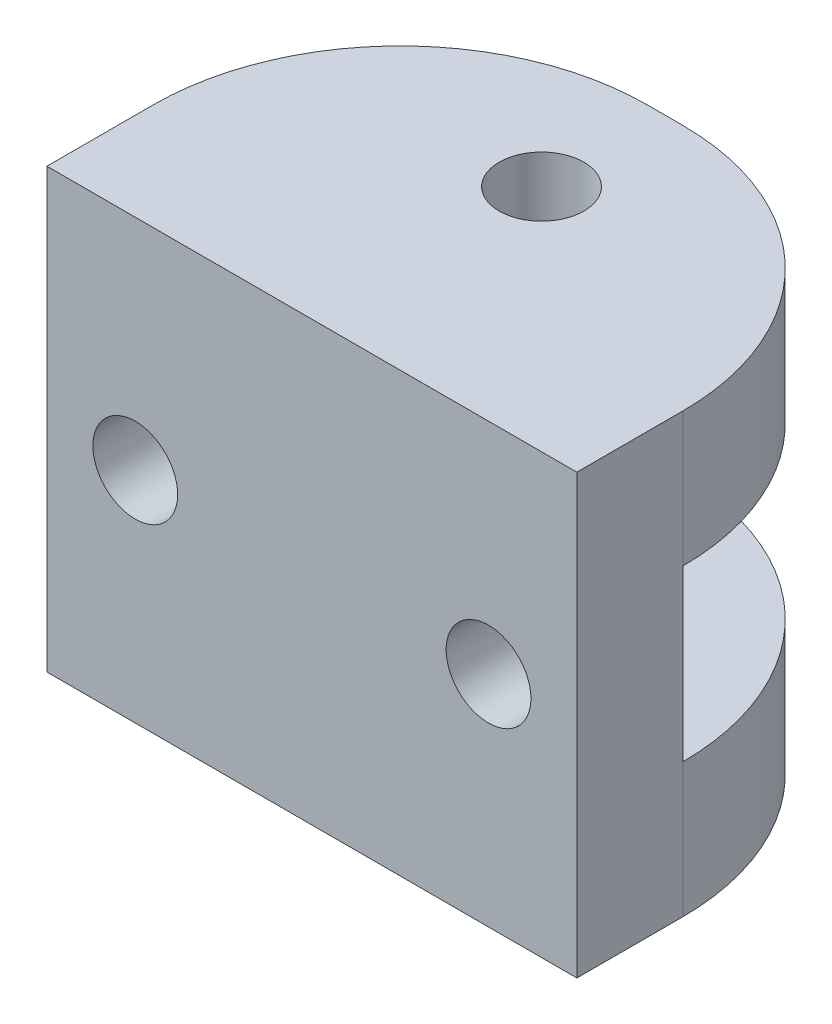
ISO-10303-21;
HEADER;
FILE_DESCRIPTION(('STEP AP214'),'2;1');
FILE_NAME('part.step','',(''),(''),'','','');
FILE_SCHEMA(('AUTOMOTIVE_DESIGN { 1 0 10303 214 1 1 1 1 }'));
ENDSEC;
DATA;
#1=APPLICATION_CONTEXT('core data for automotive mechanical design processes');
#2=APPLICATION_PROTOCOL_DEFINITION('international standard','automotive_design',2000,#1);
#3=PRODUCT_CONTEXT('',#1,'mechanical');
#4=PRODUCT('Part','Part','',(#3));
#5=PRODUCT_RELATED_PRODUCT_CATEGORY('part','',(#4));
#6=PRODUCT_DEFINITION_FORMATION('','',#4);
#7=PRODUCT_DEFINITION_CONTEXT('part definition',#1,'design');
#8=PRODUCT_DEFINITION('design','',#6,#7);
#9=PRODUCT_DEFINITION_SHAPE('','',#8);
#10=(LENGTH_UNIT() NAMED_UNIT(*) SI_UNIT(.MILLI.,.METRE.));
#11=(NAMED_UNIT(*) PLANE_ANGLE_UNIT() SI_UNIT($,.RADIAN.));
#12=(NAMED_UNIT(*) SI_UNIT($,.STERADIAN.) SOLID_ANGLE_UNIT());
#13=UNCERTAINTY_MEASURE_WITH_UNIT(LENGTH_MEASURE(1.E-05),#10,'distance_accuracy_value','');
#14=(GEOMETRIC_REPRESENTATION_CONTEXT(3) GLOBAL_UNCERTAINTY_ASSIGNED_CONTEXT((#13)) GLOBAL_UNIT_ASSIGNED_CONTEXT((#10,
#11,#12)) REPRESENTATION_CONTEXT('',''));
#15=CARTESIAN_POINT('',(0.,0.,0.));
#16=DIRECTION('',(0.,0.,1.));
#17=DIRECTION('',(1.,0.,0.));
#18=AXIS2_PLACEMENT_3D('',#15,#16,#17);
#19=CARTESIAN_POINT('',(75.,0.,0.));
#20=DIRECTION('',(0.,0.,-1.));
#21=DIRECTION('',(-1.,0.,0.));
#22=AXIS2_PLACEMENT_3D('',#19,#20,#21);
#23=PLANE('',#22);
#24=CARTESIAN_POINT('',(62.5,31.,0.));
#25=DIRECTION('',(0.,0.,1.));
#26=DIRECTION('',(1.,0.,0.));
#27=AXIS2_PLACEMENT_3D('',#24,#25,#26);
#28=CIRCLE('',#27,5.99999999999998);
#29=CARTESIAN_POINT('',(68.5,31.,0.));
#30=VERTEX_POINT('',#29);
#31=EDGE_CURVE('E152',#30,#30,#28,.T.);
#32=ORIENTED_EDGE('',*,*,#31,.F.);
#33=EDGE_LOOP('',(#32));
#34=FACE_BOUND('',#33,.T.);
#35=CARTESIAN_POINT('',(12.5,31.,0.));
#36=DIRECTION('',(0.,0.,1.));
#37=DIRECTION('',(1.,0.,0.));
#38=AXIS2_PLACEMENT_3D('',#35,#36,#37);
#39=CIRCLE('',#38,6.);
#40=CARTESIAN_POINT('',(18.5,31.,0.));
#41=VERTEX_POINT('',#40);
#42=EDGE_CURVE('E284',#41,#41,#39,.T.);
#43=ORIENTED_EDGE('',*,*,#42,.F.);
#44=EDGE_LOOP('',(#43));
#45=FACE_BOUND('',#44,.T.);
#46=DIRECTION('',(0.,-1.,0.));
#47=VECTOR('',#46,1.);
#48=CARTESIAN_POINT('',(0.,0.,0.));
#49=LINE('',#48,#47);
#50=CARTESIAN_POINT('',(0.,62.,0.));
#51=VERTEX_POINT('',#50);
#52=CARTESIAN_POINT('',(0.,0.,0.));
#53=VERTEX_POINT('',#52);
#54=EDGE_CURVE('E137',#51,#53,#49,.T.);
#55=ORIENTED_EDGE('',*,*,#54,.T.);
#56=DIRECTION('',(-1.,0.,0.));
#57=VECTOR('',#56,1.);
#58=CARTESIAN_POINT('',(75.,0.,0.));
#59=LINE('',#58,#57);
#60=CARTESIAN_POINT('',(75.,0.,0.));
#61=VERTEX_POINT('',#60);
#62=EDGE_CURVE('E116',#61,#53,#59,.T.);
#63=ORIENTED_EDGE('',*,*,#62,.F.);
#64=DIRECTION('',(0.,-1.,0.));
#65=VECTOR('',#64,1.);
#66=CARTESIAN_POINT('',(75.,0.,0.));
#67=LINE('',#66,#65);
#68=CARTESIAN_POINT('',(75.,62.,0.));
#69=VERTEX_POINT('',#68);
#70=EDGE_CURVE('E124',#69,#61,#67,.T.);
#71=ORIENTED_EDGE('',*,*,#70,.F.);
#72=DIRECTION('',(-1.,0.,0.));
#73=VECTOR('',#72,1.);
#74=CARTESIAN_POINT('',(75.,62.,0.));
#75=LINE('',#74,#73);
#76=EDGE_CURVE('E204',#69,#51,#75,.T.);
#77=ORIENTED_EDGE('',*,*,#76,.T.);
#78=EDGE_LOOP('',(#55,#63,#71,#77));
#79=FACE_BOUND('',#78,.T.);
#80=ADVANCED_FACE('F33',(#34,#45,#79),#23,.F.);
#81=CARTESIAN_POINT('',(75.,0.,0.));
#82=DIRECTION('',(0.,1.,0.));
#83=DIRECTION('',(0.,0.,1.));
#84=AXIS2_PLACEMENT_3D('',#81,#82,#83);
#85=PLANE('',#84);
#86=CARTESIAN_POINT('',(37.5,0.,-32.5));
#87=DIRECTION('',(0.,1.,0.));
#88=DIRECTION('',(0.,0.,1.));
#89=AXIS2_PLACEMENT_3D('',#86,#87,#88);
#90=CIRCLE('',#89,5.99999999999999);
#91=CARTESIAN_POINT('',(37.5,0.,-26.5));
#92=VERTEX_POINT('',#91);
#93=EDGE_CURVE('E409',#92,#92,#90,.T.);
#94=ORIENTED_EDGE('',*,*,#93,.T.);
#95=EDGE_LOOP('',(#94));
#96=FACE_BOUND('',#95,.T.);
#97=DIRECTION('',(-1.,0.,0.));
#98=VECTOR('',#97,1.);
#99=CARTESIAN_POINT('',(75.,0.,-50.));
#100=LINE('',#99,#98);
#101=CARTESIAN_POINT('',(40.,0.,-50.));
#102=VERTEX_POINT('',#101);
#103=CARTESIAN_POINT('',(35.,0.,-50.));
#104=VERTEX_POINT('',#103);
#105=EDGE_CURVE('E139',#102,#104,#100,.T.);
#106=ORIENTED_EDGE('',*,*,#105,.F.);
#107=CARTESIAN_POINT('',(40.,0.,-15.));
#108=DIRECTION('',(0.,1.,0.));
#109=DIRECTION('',(0.,0.,1.));
#110=AXIS2_PLACEMENT_3D('',#107,#108,#109);
#111=CIRCLE('',#110,35.);
#112=CARTESIAN_POINT('',(75.,0.,-15.));
#113=VERTEX_POINT('',#112);
#114=EDGE_CURVE('E119',#102,#113,#111,.F.);
#115=ORIENTED_EDGE('',*,*,#114,.T.);
#116=DIRECTION('',(0.,0.,-1.));
#117=VECTOR('',#116,1.);
#118=CARTESIAN_POINT('',(75.,0.,0.));
#119=LINE('',#118,#117);
#120=EDGE_CURVE('E110',#61,#113,#119,.T.);
#121=ORIENTED_EDGE('',*,*,#120,.F.);
#122=ORIENTED_EDGE('',*,*,#62,.T.);
#123=DIRECTION('',(0.,0.,-1.));
#124=VECTOR('',#123,1.);
#125=CARTESIAN_POINT('',(0.,0.,0.));
#126=LINE('',#125,#124);
#127=CARTESIAN_POINT('',(0.,0.,-15.));
#128=VERTEX_POINT('',#127);
#129=EDGE_CURVE('E294',#53,#128,#126,.T.);
#130=ORIENTED_EDGE('',*,*,#129,.T.);
#131=CARTESIAN_POINT('',(35.,0.,-15.));
#132=DIRECTION('',(0.,1.,0.));
#133=DIRECTION('',(0.,0.,1.));
#134=AXIS2_PLACEMENT_3D('',#131,#132,#133);
#135=CIRCLE('',#134,35.);
#136=EDGE_CURVE('E165',#128,#104,#135,.F.);
#137=ORIENTED_EDGE('',*,*,#136,.T.);
#138=EDGE_LOOP('',(#106,#115,#121,#122,#130,#137));
#139=FACE_BOUND('',#138,.T.);
#140=ADVANCED_FACE('F113',(#96,#139),#85,.F.);
#141=CARTESIAN_POINT('',(75.,19.,-50.));
#142=DIRECTION('',(0.,0.,1.));
#143=DIRECTION('',(1.,0.,0.));
#144=AXIS2_PLACEMENT_3D('',#141,#142,#143);
#145=PLANE('',#144);
#146=DIRECTION('',(-1.,0.,0.));
#147=VECTOR('',#146,1.);
#148=CARTESIAN_POINT('',(75.,19.,-50.));
#149=LINE('',#148,#147);
#150=CARTESIAN_POINT('',(40.,19.,-50.));
#151=VERTEX_POINT('',#150);
#152=CARTESIAN_POINT('',(35.,19.,-50.));
#153=VERTEX_POINT('',#152);
#154=EDGE_CURVE('E144',#151,#153,#149,.T.);
#155=ORIENTED_EDGE('',*,*,#154,.F.);
#156=DIRECTION('',(0.,1.,0.));
#157=VECTOR('',#156,1.);
#158=CARTESIAN_POINT('',(40.,19.,-50.));
#159=LINE('',#158,#157);
#160=EDGE_CURVE('E163',#151,#102,#159,.F.);
#161=ORIENTED_EDGE('',*,*,#160,.T.);
#162=ORIENTED_EDGE('',*,*,#105,.T.);
#163=DIRECTION('',(0.,1.,0.));
#164=VECTOR('',#163,1.);
#165=CARTESIAN_POINT('',(35.,19.,-50.));
#166=LINE('',#165,#164);
#167=EDGE_CURVE('E160',#104,#153,#166,.T.);
#168=ORIENTED_EDGE('',*,*,#167,.T.);
#169=EDGE_LOOP('',(#155,#161,#162,#168));
#170=FACE_BOUND('',#169,.T.);
#171=ADVANCED_FACE('F216',(#170),#145,.F.);
#172=CARTESIAN_POINT('',(75.,19.,-15.));
#173=DIRECTION('',(0.,-1.,0.));
#174=DIRECTION('',(0.,0.,-1.));
#175=AXIS2_PLACEMENT_3D('',#172,#173,#174);
#176=PLANE('',#175);
#177=CARTESIAN_POINT('',(37.5,19.,-32.5));
#178=DIRECTION('',(0.,-1.,0.));
#179=DIRECTION('',(0.,0.,-1.));
#180=AXIS2_PLACEMENT_3D('',#177,#178,#179);
#181=CIRCLE('',#180,5.99999999999999);
#182=CARTESIAN_POINT('',(37.5,19.,-38.5));
#183=VERTEX_POINT('',#182);
#184=EDGE_CURVE('E287',#183,#183,#181,.T.);
#185=ORIENTED_EDGE('',*,*,#184,.T.);
#186=EDGE_LOOP('',(#185));
#187=FACE_BOUND('',#186,.T.);
#188=DIRECTION('',(-1.,0.,0.));
#189=VECTOR('',#188,1.);
#190=CARTESIAN_POINT('',(75.,19.,-15.));
#191=LINE('',#190,#189);
#192=CARTESIAN_POINT('',(75.,19.,-15.));
#193=VERTEX_POINT('',#192);
#194=CARTESIAN_POINT('',(0.,19.,-15.));
#195=VERTEX_POINT('',#194);
#196=EDGE_CURVE('E196',#193,#195,#191,.T.);
#197=ORIENTED_EDGE('',*,*,#196,.F.);
#198=CARTESIAN_POINT('',(40.,19.,-15.));
#199=DIRECTION('',(0.,-1.,0.));
#200=DIRECTION('',(0.,0.,-1.));
#201=AXIS2_PLACEMENT_3D('',#198,#199,#200);
#202=CIRCLE('',#201,35.);
#203=EDGE_CURVE('E158',#193,#151,#202,.F.);
#204=ORIENTED_EDGE('',*,*,#203,.T.);
#205=ORIENTED_EDGE('',*,*,#154,.T.);
#206=CARTESIAN_POINT('',(35.,19.,-15.));
#207=DIRECTION('',(0.,-1.,0.));
#208=DIRECTION('',(0.,0.,-1.));
#209=AXIS2_PLACEMENT_3D('',#206,#207,#208);
#210=CIRCLE('',#209,35.);
#211=EDGE_CURVE('E156',#153,#195,#210,.F.);
#212=ORIENTED_EDGE('',*,*,#211,.T.);
#213=EDGE_LOOP('',(#197,#204,#205,#212));
#214=FACE_BOUND('',#213,.T.);
#215=ADVANCED_FACE('F213',(#187,#214),#176,.F.);
#216=CARTESIAN_POINT('',(75.,43.,-15.));
#217=DIRECTION('',(0.,0.,1.));
#218=DIRECTION('',(1.,0.,0.));
#219=AXIS2_PLACEMENT_3D('',#216,#217,#218);
#220=PLANE('',#219);
#221=CARTESIAN_POINT('',(62.5,31.,-15.));
#222=DIRECTION('',(0.,0.,1.));
#223=DIRECTION('',(1.,0.,0.));
#224=AXIS2_PLACEMENT_3D('',#221,#222,#223);
#225=CIRCLE('',#224,5.99999999999998);
#226=CARTESIAN_POINT('',(68.5,31.,-15.));
#227=VERTEX_POINT('',#226);
#228=EDGE_CURVE('E151',#227,#227,#225,.T.);
#229=ORIENTED_EDGE('',*,*,#228,.T.);
#230=EDGE_LOOP('',(#229));
#231=FACE_BOUND('',#230,.T.);
#232=CARTESIAN_POINT('',(12.5,31.,-15.));
#233=DIRECTION('',(0.,0.,1.));
#234=DIRECTION('',(1.,0.,0.));
#235=AXIS2_PLACEMENT_3D('',#232,#233,#234);
#236=CIRCLE('',#235,6.);
#237=CARTESIAN_POINT('',(18.5,31.,-15.));
#238=VERTEX_POINT('',#237);
#239=EDGE_CURVE('E148',#238,#238,#236,.T.);
#240=ORIENTED_EDGE('',*,*,#239,.T.);
#241=EDGE_LOOP('',(#240));
#242=FACE_BOUND('',#241,.T.);
#243=DIRECTION('',(0.,1.,0.));
#244=VECTOR('',#243,1.);
#245=CARTESIAN_POINT('',(0.,43.,-15.));
#246=LINE('',#245,#244);
#247=CARTESIAN_POINT('',(0.,43.,-15.));
#248=VERTEX_POINT('',#247);
#249=EDGE_CURVE('E195',#195,#248,#246,.T.);
#250=ORIENTED_EDGE('',*,*,#249,.T.);
#251=DIRECTION('',(-1.,0.,0.));
#252=VECTOR('',#251,1.);
#253=CARTESIAN_POINT('',(75.,43.,-15.));
#254=LINE('',#253,#252);
#255=CARTESIAN_POINT('',(75.,43.,-15.));
#256=VERTEX_POINT('',#255);
#257=EDGE_CURVE('E183',#256,#248,#254,.T.);
#258=ORIENTED_EDGE('',*,*,#257,.F.);
#259=DIRECTION('',(0.,1.,0.));
#260=VECTOR('',#259,1.);
#261=CARTESIAN_POINT('',(75.,43.,-15.));
#262=LINE('',#261,#260);
#263=EDGE_CURVE('E123',#193,#256,#262,.T.);
#264=ORIENTED_EDGE('',*,*,#263,.F.);
#265=ORIENTED_EDGE('',*,*,#196,.T.);
#266=EDGE_LOOP('',(#250,#258,#264,#265));
#267=FACE_BOUND('',#266,.T.);
#268=ADVANCED_FACE('F193',(#231,#242,#267),#220,.F.);
#269=CARTESIAN_POINT('',(75.,43.,-50.));
#270=DIRECTION('',(0.,1.,0.));
#271=DIRECTION('',(0.,0.,1.));
#272=AXIS2_PLACEMENT_3D('',#269,#270,#271);
#273=PLANE('',#272);
#274=CARTESIAN_POINT('',(37.5,43.,-32.5));
#275=DIRECTION('',(0.,1.,0.));
#276=DIRECTION('',(0.,0.,1.));
#277=AXIS2_PLACEMENT_3D('',#274,#275,#276);
#278=CIRCLE('',#277,5.99999999999999);
#279=CARTESIAN_POINT('',(37.5,43.,-26.5));
#280=VERTEX_POINT('',#279);
#281=EDGE_CURVE('E406',#280,#280,#278,.T.);
#282=ORIENTED_EDGE('',*,*,#281,.T.);
#283=EDGE_LOOP('',(#282));
#284=FACE_BOUND('',#283,.T.);
#285=ORIENTED_EDGE('',*,*,#257,.T.);
#286=CARTESIAN_POINT('',(35.,43.,-15.));
#287=DIRECTION('',(0.,1.,0.));
#288=DIRECTION('',(0.,0.,1.));
#289=AXIS2_PLACEMENT_3D('',#286,#287,#288);
#290=CIRCLE('',#289,35.);
#291=CARTESIAN_POINT('',(35.,43.,-50.));
#292=VERTEX_POINT('',#291);
#293=EDGE_CURVE('E11',#248,#292,#290,.F.);
#294=ORIENTED_EDGE('',*,*,#293,.T.);
#295=DIRECTION('',(-1.,0.,0.));
#296=VECTOR('',#295,1.);
#297=CARTESIAN_POINT('',(75.,43.,-50.));
#298=LINE('',#297,#296);
#299=CARTESIAN_POINT('',(40.,43.,-50.));
#300=VERTEX_POINT('',#299);
#301=EDGE_CURVE('E184',#300,#292,#298,.T.);
#302=ORIENTED_EDGE('',*,*,#301,.F.);
#303=CARTESIAN_POINT('',(40.,43.,-15.));
#304=DIRECTION('',(0.,1.,0.));
#305=DIRECTION('',(0.,0.,1.));
#306=AXIS2_PLACEMENT_3D('',#303,#304,#305);
#307=CIRCLE('',#306,35.);
#308=EDGE_CURVE('E41',#300,#256,#307,.F.);
#309=ORIENTED_EDGE('',*,*,#308,.T.);
#310=EDGE_LOOP('',(#285,#294,#302,#309));
#311=FACE_BOUND('',#310,.T.);
#312=ADVANCED_FACE('F181',(#284,#311),#273,.F.);
#313=CARTESIAN_POINT('',(75.,62.,-50.));
#314=DIRECTION('',(0.,0.,1.));
#315=DIRECTION('',(1.,0.,0.));
#316=AXIS2_PLACEMENT_3D('',#313,#314,#315);
#317=PLANE('',#316);
#318=ORIENTED_EDGE('',*,*,#301,.T.);
#319=DIRECTION('',(0.,1.,0.));
#320=VECTOR('',#319,1.);
#321=CARTESIAN_POINT('',(35.,62.,-50.));
#322=LINE('',#321,#320);
#323=CARTESIAN_POINT('',(35.,62.,-50.));
#324=VERTEX_POINT('',#323);
#325=EDGE_CURVE('E173',#292,#324,#322,.T.);
#326=ORIENTED_EDGE('',*,*,#325,.T.);
#327=DIRECTION('',(-1.,0.,0.));
#328=VECTOR('',#327,1.);
#329=CARTESIAN_POINT('',(75.,62.,-50.));
#330=LINE('',#329,#328);
#331=CARTESIAN_POINT('',(40.,62.,-50.));
#332=VERTEX_POINT('',#331);
#333=EDGE_CURVE('E201',#332,#324,#330,.T.);
#334=ORIENTED_EDGE('',*,*,#333,.F.);
#335=DIRECTION('',(0.,1.,0.));
#336=VECTOR('',#335,1.);
#337=CARTESIAN_POINT('',(40.,62.,-50.));
#338=LINE('',#337,#336);
#339=EDGE_CURVE('E53',#332,#300,#338,.F.);
#340=ORIENTED_EDGE('',*,*,#339,.T.);
#341=EDGE_LOOP('',(#318,#326,#334,#340));
#342=FACE_BOUND('',#341,.T.);
#343=ADVANCED_FACE('F202',(#342),#317,.F.);
#344=CARTESIAN_POINT('',(75.,62.,0.));
#345=DIRECTION('',(0.,-1.,0.));
#346=DIRECTION('',(0.,0.,-1.));
#347=AXIS2_PLACEMENT_3D('',#344,#345,#346);
#348=PLANE('',#347);
#349=CARTESIAN_POINT('',(37.5,62.,-32.5));
#350=DIRECTION('',(0.,1.,0.));
#351=DIRECTION('',(0.,0.,1.));
#352=AXIS2_PLACEMENT_3D('',#349,#350,#351);
#353=CIRCLE('',#352,5.99999999999999);
#354=CARTESIAN_POINT('',(37.5,62.,-26.5));
#355=VERTEX_POINT('',#354);
#356=EDGE_CURVE('E410',#355,#355,#353,.T.);
#357=ORIENTED_EDGE('',*,*,#356,.F.);
#358=EDGE_LOOP('',(#357));
#359=FACE_BOUND('',#358,.T.);
#360=ORIENTED_EDGE('',*,*,#333,.T.);
#361=CARTESIAN_POINT('',(35.,62.,-15.));
#362=DIRECTION('',(0.,-1.,0.));
#363=DIRECTION('',(0.,0.,-1.));
#364=AXIS2_PLACEMENT_3D('',#361,#362,#363);
#365=CIRCLE('',#364,35.);
#366=CARTESIAN_POINT('',(0.,62.,-15.));
#367=VERTEX_POINT('',#366);
#368=EDGE_CURVE('E178',#324,#367,#365,.F.);
#369=ORIENTED_EDGE('',*,*,#368,.T.);
#370=DIRECTION('',(0.,0.,1.));
#371=VECTOR('',#370,1.);
#372=CARTESIAN_POINT('',(0.,62.,0.));
#373=LINE('',#372,#371);
#374=EDGE_CURVE('E134',#367,#51,#373,.T.);
#375=ORIENTED_EDGE('',*,*,#374,.T.);
#376=ORIENTED_EDGE('',*,*,#76,.F.);
#377=DIRECTION('',(0.,0.,1.));
#378=VECTOR('',#377,1.);
#379=CARTESIAN_POINT('',(75.,62.,0.));
#380=LINE('',#379,#378);
#381=CARTESIAN_POINT('',(75.,62.,-15.));
#382=VERTEX_POINT('',#381);
#383=EDGE_CURVE('E130',#382,#69,#380,.T.);
#384=ORIENTED_EDGE('',*,*,#383,.F.);
#385=CARTESIAN_POINT('',(40.,62.,-15.));
#386=DIRECTION('',(0.,-1.,0.));
#387=DIRECTION('',(0.,0.,-1.));
#388=AXIS2_PLACEMENT_3D('',#385,#386,#387);
#389=CIRCLE('',#388,35.);
#390=EDGE_CURVE('E176',#382,#332,#389,.F.);
#391=ORIENTED_EDGE('',*,*,#390,.T.);
#392=EDGE_LOOP('',(#360,#369,#375,#376,#384,#391));
#393=FACE_BOUND('',#392,.T.);
#394=ADVANCED_FACE('F200',(#359,#393),#348,.F.);
#395=CARTESIAN_POINT('',(75.,0.,0.));
#396=DIRECTION('',(-1.,0.,0.));
#397=DIRECTION('',(0.,0.,1.));
#398=AXIS2_PLACEMENT_3D('',#395,#396,#397);
#399=PLANE('',#398);
#400=ORIENTED_EDGE('',*,*,#120,.T.);
#401=DIRECTION('',(0.,1.,0.));
#402=VECTOR('',#401,1.);
#403=CARTESIAN_POINT('',(75.,0.,-15.));
#404=LINE('',#403,#402);
#405=EDGE_CURVE('E141',#113,#193,#404,.T.);
#406=ORIENTED_EDGE('',*,*,#405,.T.);
#407=ORIENTED_EDGE('',*,*,#263,.T.);
#408=DIRECTION('',(0.,1.,0.));
#409=VECTOR('',#408,1.);
#410=CARTESIAN_POINT('',(75.,0.,-15.));
#411=LINE('',#410,#409);
#412=EDGE_CURVE('E138',#256,#382,#411,.T.);
#413=ORIENTED_EDGE('',*,*,#412,.T.);
#414=ORIENTED_EDGE('',*,*,#383,.T.);
#415=ORIENTED_EDGE('',*,*,#70,.T.);
#416=EDGE_LOOP('',(#400,#406,#407,#413,#414,#415));
#417=FACE_BOUND('',#416,.T.);
#418=ADVANCED_FACE('F127',(#417),#399,.F.);
#419=CARTESIAN_POINT('',(0.,0.,0.));
#420=DIRECTION('',(-1.,0.,0.));
#421=DIRECTION('',(0.,0.,1.));
#422=AXIS2_PLACEMENT_3D('',#419,#420,#421);
#423=PLANE('',#422);
#424=ORIENTED_EDGE('',*,*,#249,.F.);
#425=DIRECTION('',(0.,1.,0.));
#426=VECTOR('',#425,1.);
#427=CARTESIAN_POINT('',(0.,0.,-15.));
#428=LINE('',#427,#426);
#429=EDGE_CURVE('E170',#195,#128,#428,.F.);
#430=ORIENTED_EDGE('',*,*,#429,.T.);
#431=ORIENTED_EDGE('',*,*,#129,.F.);
#432=ORIENTED_EDGE('',*,*,#54,.F.);
#433=ORIENTED_EDGE('',*,*,#374,.F.);
#434=DIRECTION('',(0.,1.,0.));
#435=VECTOR('',#434,1.);
#436=CARTESIAN_POINT('',(0.,43.,-15.));
#437=LINE('',#436,#435);
#438=EDGE_CURVE('E168',#367,#248,#437,.F.);
#439=ORIENTED_EDGE('',*,*,#438,.T.);
#440=EDGE_LOOP('',(#424,#430,#431,#432,#433,#439));
#441=FACE_BOUND('',#440,.T.);
#442=ADVANCED_FACE('F261',(#441),#423,.T.);
#443=CARTESIAN_POINT('',(12.5,31.,-50.));
#444=DIRECTION('',(0.,0.,1.));
#445=DIRECTION('',(1.,0.,0.));
#446=AXIS2_PLACEMENT_3D('',#443,#444,#445);
#447=CYLINDRICAL_SURFACE('',#446,6.);
#448=ORIENTED_EDGE('',*,*,#42,.T.);
#449=EDGE_LOOP('',(#448));
#450=FACE_BOUND('',#449,.T.);
#451=ORIENTED_EDGE('',*,*,#239,.F.);
#452=EDGE_LOOP('',(#451));
#453=FACE_BOUND('',#452,.T.);
#454=ADVANCED_FACE('F264',(#450,#453),#447,.F.);
#455=CARTESIAN_POINT('',(62.5,31.,-50.));
#456=DIRECTION('',(0.,0.,1.));
#457=DIRECTION('',(1.,0.,0.));
#458=AXIS2_PLACEMENT_3D('',#455,#456,#457);
#459=CYLINDRICAL_SURFACE('',#458,5.99999999999998);
#460=ORIENTED_EDGE('',*,*,#31,.T.);
#461=EDGE_LOOP('',(#460));
#462=FACE_BOUND('',#461,.T.);
#463=ORIENTED_EDGE('',*,*,#228,.F.);
#464=EDGE_LOOP('',(#463));
#465=FACE_BOUND('',#464,.T.);
#466=ADVANCED_FACE('F270',(#462,#465),#459,.F.);
#467=CARTESIAN_POINT('',(37.5,0.,-32.5));
#468=DIRECTION('',(0.,1.,0.));
#469=DIRECTION('',(0.,0.,1.));
#470=AXIS2_PLACEMENT_3D('',#467,#468,#469);
#471=CYLINDRICAL_SURFACE('',#470,5.99999999999999);
#472=ORIENTED_EDGE('',*,*,#356,.T.);
#473=EDGE_LOOP('',(#472));
#474=FACE_BOUND('',#473,.T.);
#475=ORIENTED_EDGE('',*,*,#281,.F.);
#476=EDGE_LOOP('',(#475));
#477=FACE_BOUND('',#476,.T.);
#478=ADVANCED_FACE('F231',(#474,#477),#471,.F.);
#479=ORIENTED_EDGE('',*,*,#93,.F.);
#480=EDGE_LOOP('',(#479));
#481=FACE_BOUND('',#480,.T.);
#482=ORIENTED_EDGE('',*,*,#184,.F.);
#483=EDGE_LOOP('',(#482));
#484=FACE_BOUND('',#483,.T.);
#485=ADVANCED_FACE('F222',(#481,#484),#471,.F.);
#486=CARTESIAN_POINT('',(40.,0.,-15.));
#487=DIRECTION('',(0.,1.,0.));
#488=DIRECTION('',(0.,0.,1.));
#489=AXIS2_PLACEMENT_3D('',#486,#487,#488);
#490=CYLINDRICAL_SURFACE('',#489,35.);
#491=ORIENTED_EDGE('',*,*,#114,.F.);
#492=ORIENTED_EDGE('',*,*,#160,.F.);
#493=ORIENTED_EDGE('',*,*,#203,.F.);
#494=ORIENTED_EDGE('',*,*,#405,.F.);
#495=EDGE_LOOP('',(#491,#492,#493,#494));
#496=FACE_BOUND('',#495,.T.);
#497=ADVANCED_FACE('F219',(#496),#490,.T.);
#498=CARTESIAN_POINT('',(35.,19.,-15.));
#499=DIRECTION('',(0.,-1.,0.));
#500=DIRECTION('',(0.,0.,-1.));
#501=AXIS2_PLACEMENT_3D('',#498,#499,#500);
#502=CYLINDRICAL_SURFACE('',#501,35.);
#503=ORIENTED_EDGE('',*,*,#136,.F.);
#504=ORIENTED_EDGE('',*,*,#429,.F.);
#505=ORIENTED_EDGE('',*,*,#211,.F.);
#506=ORIENTED_EDGE('',*,*,#167,.F.);
#507=EDGE_LOOP('',(#503,#504,#505,#506));
#508=FACE_BOUND('',#507,.T.);
#509=ADVANCED_FACE('F221',(#508),#502,.T.);
#510=CARTESIAN_POINT('',(35.,62.,-15.));
#511=DIRECTION('',(0.,-1.,0.));
#512=DIRECTION('',(0.,0.,-1.));
#513=AXIS2_PLACEMENT_3D('',#510,#511,#512);
#514=CYLINDRICAL_SURFACE('',#513,35.);
#515=ORIENTED_EDGE('',*,*,#293,.F.);
#516=ORIENTED_EDGE('',*,*,#438,.F.);
#517=ORIENTED_EDGE('',*,*,#368,.F.);
#518=ORIENTED_EDGE('',*,*,#325,.F.);
#519=EDGE_LOOP('',(#515,#516,#517,#518));
#520=FACE_BOUND('',#519,.T.);
#521=ADVANCED_FACE('F228',(#520),#514,.T.);
#522=CARTESIAN_POINT('',(40.,0.,-15.));
#523=DIRECTION('',(0.,1.,0.));
#524=DIRECTION('',(0.,0.,1.));
#525=AXIS2_PLACEMENT_3D('',#522,#523,#524);
#526=CYLINDRICAL_SURFACE('',#525,35.);
#527=ORIENTED_EDGE('',*,*,#308,.F.);
#528=ORIENTED_EDGE('',*,*,#339,.F.);
#529=ORIENTED_EDGE('',*,*,#390,.F.);
#530=ORIENTED_EDGE('',*,*,#412,.F.);
#531=EDGE_LOOP('',(#527,#528,#529,#530));
#532=FACE_BOUND('',#531,.T.);
#533=ADVANCED_FACE('F35',(#532),#526,.T.);
#534=CLOSED_SHELL('',(#80,#140,#171,#215,#268,#312,#343,#394,#418,#442,#454,#466,#478,#485,#497,
#509,#521,#533));
#535=MANIFOLD_SOLID_BREP('B2',#534);
#536=ADVANCED_BREP_SHAPE_REPRESENTATION('',(#18,#535),#14);
#537=SHAPE_DEFINITION_REPRESENTATION(#9,#536);
ENDSEC;
END-ISO-10303-21;
